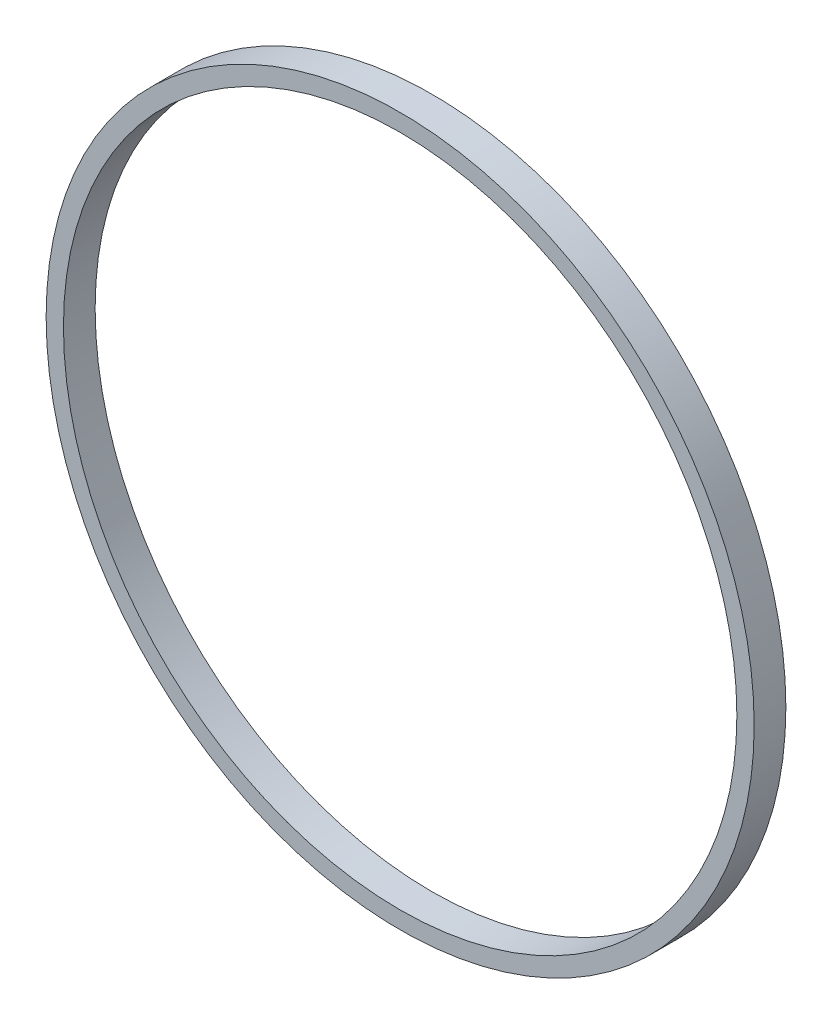
ISO-10303-21;
HEADER;
FILE_DESCRIPTION(('STEP AP214'),'2;1');
FILE_NAME('part.step','',(''),(''),'','','');
FILE_SCHEMA(('AUTOMOTIVE_DESIGN { 1 0 10303 214 1 1 1 1 }'));
ENDSEC;
DATA;
#1=APPLICATION_CONTEXT('core data for automotive mechanical design processes');
#2=APPLICATION_PROTOCOL_DEFINITION('international standard','automotive_design',2000,#1);
#3=PRODUCT_CONTEXT('',#1,'mechanical');
#4=PRODUCT('Part','Part','',(#3));
#5=PRODUCT_RELATED_PRODUCT_CATEGORY('part','',(#4));
#6=PRODUCT_DEFINITION_FORMATION('','',#4);
#7=PRODUCT_DEFINITION_CONTEXT('part definition',#1,'design');
#8=PRODUCT_DEFINITION('design','',#6,#7);
#9=PRODUCT_DEFINITION_SHAPE('','',#8);
#10=(LENGTH_UNIT() NAMED_UNIT(*) SI_UNIT(.MILLI.,.METRE.));
#11=(NAMED_UNIT(*) PLANE_ANGLE_UNIT() SI_UNIT($,.RADIAN.));
#12=(NAMED_UNIT(*) SI_UNIT($,.STERADIAN.) SOLID_ANGLE_UNIT());
#13=UNCERTAINTY_MEASURE_WITH_UNIT(LENGTH_MEASURE(1.E-05),#10,'distance_accuracy_value','');
#14=(GEOMETRIC_REPRESENTATION_CONTEXT(3) GLOBAL_UNCERTAINTY_ASSIGNED_CONTEXT((#13)) GLOBAL_UNIT_ASSIGNED_CONTEXT((#10,
#11,#12)) REPRESENTATION_CONTEXT('',''));
#15=CARTESIAN_POINT('',(0.,0.,0.));
#16=DIRECTION('',(0.,0.,1.));
#17=DIRECTION('',(1.,0.,0.));
#18=AXIS2_PLACEMENT_3D('',#15,#16,#17);
#19=CARTESIAN_POINT('',(0.,0.,4.3942));
#20=DIRECTION('',(0.,0.,1.));
#21=DIRECTION('',(1.,0.,0.));
#22=AXIS2_PLACEMENT_3D('',#19,#20,#21);
#23=PLANE('',#22);
#24=CARTESIAN_POINT('',(0.,0.,4.3942));
#25=DIRECTION('',(0.,0.,1.));
#26=DIRECTION('',(1.,0.,0.));
#27=AXIS2_PLACEMENT_3D('',#24,#25,#26);
#28=CIRCLE('',#27,49.0855);
#29=CARTESIAN_POINT('',(49.0855,0.,4.3942));
#30=VERTEX_POINT('',#29);
#31=EDGE_CURVE('E10',#30,#30,#28,.T.);
#32=ORIENTED_EDGE('',*,*,#31,.T.);
#33=EDGE_LOOP('',(#32));
#34=FACE_BOUND('',#33,.T.);
#35=CARTESIAN_POINT('',(0.,0.,4.3942));
#36=DIRECTION('',(0.,0.,1.));
#37=DIRECTION('',(1.,0.,0.));
#38=AXIS2_PLACEMENT_3D('',#35,#36,#37);
#39=CIRCLE('',#38,46.6852);
#40=CARTESIAN_POINT('',(46.6852,0.,4.3942));
#41=VERTEX_POINT('',#40);
#42=EDGE_CURVE('E44',#41,#41,#39,.T.);
#43=ORIENTED_EDGE('',*,*,#42,.F.);
#44=EDGE_LOOP('',(#43));
#45=FACE_BOUND('',#44,.T.);
#46=ADVANCED_FACE('F33',(#34,#45),#23,.T.);
#47=CARTESIAN_POINT('',(0.,0.,0.));
#48=DIRECTION('',(0.,0.,1.));
#49=DIRECTION('',(1.,0.,0.));
#50=AXIS2_PLACEMENT_3D('',#47,#48,#49);
#51=PLANE('',#50);
#52=CARTESIAN_POINT('',(0.,0.,0.));
#53=DIRECTION('',(0.,0.,1.));
#54=DIRECTION('',(1.,0.,0.));
#55=AXIS2_PLACEMENT_3D('',#52,#53,#54);
#56=CIRCLE('',#55,49.0855);
#57=CARTESIAN_POINT('',(49.0855,0.,0.));
#58=VERTEX_POINT('',#57);
#59=EDGE_CURVE('E37',#58,#58,#56,.T.);
#60=ORIENTED_EDGE('',*,*,#59,.F.);
#61=EDGE_LOOP('',(#60));
#62=FACE_BOUND('',#61,.T.);
#63=CARTESIAN_POINT('',(0.,0.,0.));
#64=DIRECTION('',(0.,0.,1.));
#65=DIRECTION('',(1.,0.,0.));
#66=AXIS2_PLACEMENT_3D('',#63,#64,#65);
#67=CIRCLE('',#66,46.6852);
#68=CARTESIAN_POINT('',(46.6852,0.,0.));
#69=VERTEX_POINT('',#68);
#70=EDGE_CURVE('E46',#69,#69,#67,.T.);
#71=ORIENTED_EDGE('',*,*,#70,.T.);
#72=EDGE_LOOP('',(#71));
#73=FACE_BOUND('',#72,.T.);
#74=ADVANCED_FACE('F56',(#62,#73),#51,.F.);
#75=CARTESIAN_POINT('',(0.,0.,4.3942));
#76=DIRECTION('',(0.,0.,-1.));
#77=DIRECTION('',(-1.,0.,0.));
#78=AXIS2_PLACEMENT_3D('',#75,#76,#77);
#79=CYLINDRICAL_SURFACE('',#78,49.0855);
#80=ORIENTED_EDGE('',*,*,#31,.F.);
#81=EDGE_LOOP('',(#80));
#82=FACE_BOUND('',#81,.T.);
#83=ORIENTED_EDGE('',*,*,#59,.T.);
#84=EDGE_LOOP('',(#83));
#85=FACE_BOUND('',#84,.T.);
#86=ADVANCED_FACE('F35',(#82,#85),#79,.T.);
#87=CARTESIAN_POINT('',(0.,0.,4.3942));
#88=DIRECTION('',(0.,0.,-1.));
#89=DIRECTION('',(-1.,0.,0.));
#90=AXIS2_PLACEMENT_3D('',#87,#88,#89);
#91=CYLINDRICAL_SURFACE('',#90,46.6852);
#92=ORIENTED_EDGE('',*,*,#42,.T.);
#93=EDGE_LOOP('',(#92));
#94=FACE_BOUND('',#93,.T.);
#95=ORIENTED_EDGE('',*,*,#70,.F.);
#96=EDGE_LOOP('',(#95));
#97=FACE_BOUND('',#96,.T.);
#98=ADVANCED_FACE('F52',(#94,#97),#91,.F.);
#99=CLOSED_SHELL('',(#46,#74,#86,#98));
#100=MANIFOLD_SOLID_BREP('B2',#99);
#101=ADVANCED_BREP_SHAPE_REPRESENTATION('',(#18,#100),#14);
#102=SHAPE_DEFINITION_REPRESENTATION(#9,#101);
ENDSEC;
END-ISO-10303-21;
